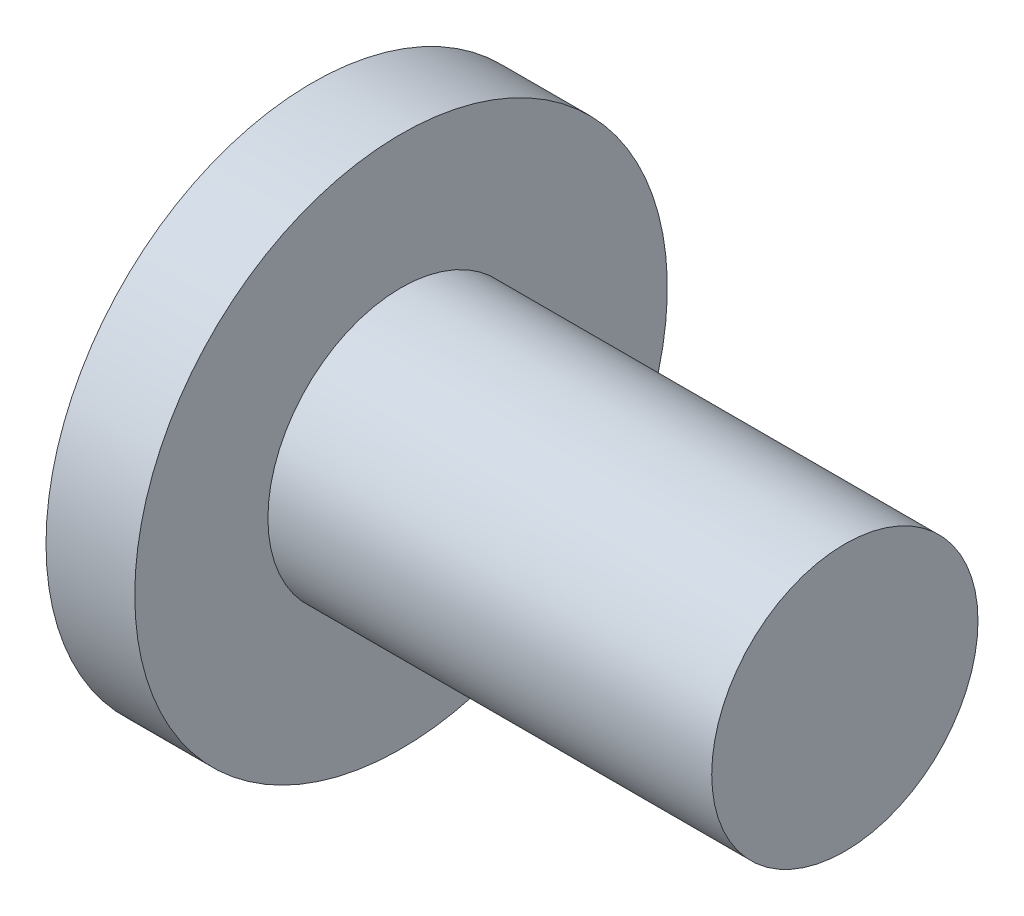
ISO-10303-21;
HEADER;
FILE_DESCRIPTION(('STEP AP214'),'2;1');
FILE_NAME('part.step','',(''),(''),'','','');
FILE_SCHEMA(('AUTOMOTIVE_DESIGN { 1 0 10303 214 1 1 1 1 }'));
ENDSEC;
DATA;
#1=APPLICATION_CONTEXT('core data for automotive mechanical design processes');
#2=APPLICATION_PROTOCOL_DEFINITION('international standard','automotive_design',2000,#1);
#3=PRODUCT_CONTEXT('',#1,'mechanical');
#4=PRODUCT('Part','Part','',(#3));
#5=PRODUCT_RELATED_PRODUCT_CATEGORY('part','',(#4));
#6=PRODUCT_DEFINITION_FORMATION('','',#4);
#7=PRODUCT_DEFINITION_CONTEXT('part definition',#1,'design');
#8=PRODUCT_DEFINITION('design','',#6,#7);
#9=PRODUCT_DEFINITION_SHAPE('','',#8);
#10=(LENGTH_UNIT() NAMED_UNIT(*) SI_UNIT(.MILLI.,.METRE.));
#11=(NAMED_UNIT(*) PLANE_ANGLE_UNIT() SI_UNIT($,.RADIAN.));
#12=(NAMED_UNIT(*) SI_UNIT($,.STERADIAN.) SOLID_ANGLE_UNIT());
#13=UNCERTAINTY_MEASURE_WITH_UNIT(LENGTH_MEASURE(1.E-05),#10,'distance_accuracy_value','');
#14=(GEOMETRIC_REPRESENTATION_CONTEXT(3) GLOBAL_UNCERTAINTY_ASSIGNED_CONTEXT((#13)) GLOBAL_UNIT_ASSIGNED_CONTEXT((#10,
#11,#12)) REPRESENTATION_CONTEXT('',''));
#15=CARTESIAN_POINT('',(0.,0.,0.));
#16=DIRECTION('',(0.,0.,1.));
#17=DIRECTION('',(1.,0.,0.));
#18=AXIS2_PLACEMENT_3D('',#15,#16,#17);
#19=CARTESIAN_POINT('',(-6.,0.,0.));
#20=DIRECTION('',(1.,0.,0.));
#21=DIRECTION('',(0.,0.,-1.));
#22=AXIS2_PLACEMENT_3D('',#19,#20,#21);
#23=PLANE('',#22);
#24=CARTESIAN_POINT('',(-6.,0.,0.));
#25=DIRECTION('',(-1.,0.,0.));
#26=DIRECTION('',(0.,0.,1.));
#27=AXIS2_PLACEMENT_3D('',#24,#25,#26);
#28=CIRCLE('',#27,6.);
#29=CARTESIAN_POINT('',(-6.,0.,6.));
#30=VERTEX_POINT('',#29);
#31=EDGE_CURVE('E10',#30,#30,#28,.T.);
#32=ORIENTED_EDGE('',*,*,#31,.T.);
#33=EDGE_LOOP('',(#32));
#34=FACE_BOUND('',#33,.T.);
#35=ADVANCED_FACE('F39',(#34),#23,.F.);
#36=CARTESIAN_POINT('',(-10.6194690265487,0.,0.));
#37=DIRECTION('',(-1.,0.,0.));
#38=DIRECTION('',(0.,0.,1.));
#39=AXIS2_PLACEMENT_3D('',#36,#37,#38);
#40=CYLINDRICAL_SURFACE('',#39,6.);
#41=ORIENTED_EDGE('',*,*,#31,.F.);
#42=EDGE_LOOP('',(#41));
#43=FACE_BOUND('',#42,.T.);
#44=CARTESIAN_POINT('',(-4.,0.,0.));
#45=DIRECTION('',(-1.,0.,0.));
#46=DIRECTION('',(0.,0.,1.));
#47=AXIS2_PLACEMENT_3D('',#44,#45,#46);
#48=CIRCLE('',#47,6.);
#49=CARTESIAN_POINT('',(-4.,0.,6.));
#50=VERTEX_POINT('',#49);
#51=EDGE_CURVE('E46',#50,#50,#48,.T.);
#52=ORIENTED_EDGE('',*,*,#51,.T.);
#53=EDGE_LOOP('',(#52));
#54=FACE_BOUND('',#53,.T.);
#55=ADVANCED_FACE('F75',(#43,#54),#40,.T.);
#56=CARTESIAN_POINT('',(-4.,6.,0.));
#57=DIRECTION('',(-1.,0.,0.));
#58=DIRECTION('',(0.,0.,1.));
#59=AXIS2_PLACEMENT_3D('',#56,#57,#58);
#60=PLANE('',#59);
#61=ORIENTED_EDGE('',*,*,#51,.F.);
#62=EDGE_LOOP('',(#61));
#63=FACE_BOUND('',#62,.T.);
#64=CARTESIAN_POINT('',(-4.,0.,0.));
#65=DIRECTION('',(-1.,0.,0.));
#66=DIRECTION('',(0.,0.,1.));
#67=AXIS2_PLACEMENT_3D('',#64,#65,#66);
#68=CIRCLE('',#67,3.);
#69=CARTESIAN_POINT('',(-4.,0.,3.));
#70=VERTEX_POINT('',#69);
#71=EDGE_CURVE('E51',#70,#70,#68,.T.);
#72=ORIENTED_EDGE('',*,*,#71,.T.);
#73=EDGE_LOOP('',(#72));
#74=FACE_BOUND('',#73,.T.);
#75=ADVANCED_FACE('F71',(#63,#74),#60,.F.);
#76=CARTESIAN_POINT('',(-10.6194690265487,0.,0.));
#77=DIRECTION('',(-1.,0.,0.));
#78=DIRECTION('',(0.,0.,1.));
#79=AXIS2_PLACEMENT_3D('',#76,#77,#78);
#80=CYLINDRICAL_SURFACE('',#79,3.);
#81=ORIENTED_EDGE('',*,*,#71,.F.);
#82=EDGE_LOOP('',(#81));
#83=FACE_BOUND('',#82,.T.);
#84=CARTESIAN_POINT('',(6.,0.,0.));
#85=DIRECTION('',(-1.,0.,0.));
#86=DIRECTION('',(0.,0.,1.));
#87=AXIS2_PLACEMENT_3D('',#84,#85,#86);
#88=CIRCLE('',#87,3.);
#89=CARTESIAN_POINT('',(6.,0.,3.));
#90=VERTEX_POINT('',#89);
#91=EDGE_CURVE('E56',#90,#90,#88,.T.);
#92=ORIENTED_EDGE('',*,*,#91,.T.);
#93=EDGE_LOOP('',(#92));
#94=FACE_BOUND('',#93,.T.);
#95=ADVANCED_FACE('F63',(#83,#94),#80,.T.);
#96=CARTESIAN_POINT('',(6.,3.,0.));
#97=DIRECTION('',(-1.,0.,0.));
#98=DIRECTION('',(0.,0.,1.));
#99=AXIS2_PLACEMENT_3D('',#96,#97,#98);
#100=PLANE('',#99);
#101=ORIENTED_EDGE('',*,*,#91,.F.);
#102=EDGE_LOOP('',(#101));
#103=FACE_BOUND('',#102,.T.);
#104=ADVANCED_FACE('F65',(#103),#100,.F.);
#105=CLOSED_SHELL('',(#35,#55,#75,#95,#104));
#106=MANIFOLD_SOLID_BREP('B2',#105);
#107=ADVANCED_BREP_SHAPE_REPRESENTATION('',(#18,#106),#14);
#108=SHAPE_DEFINITION_REPRESENTATION(#9,#107);
ENDSEC;
END-ISO-10303-21;
